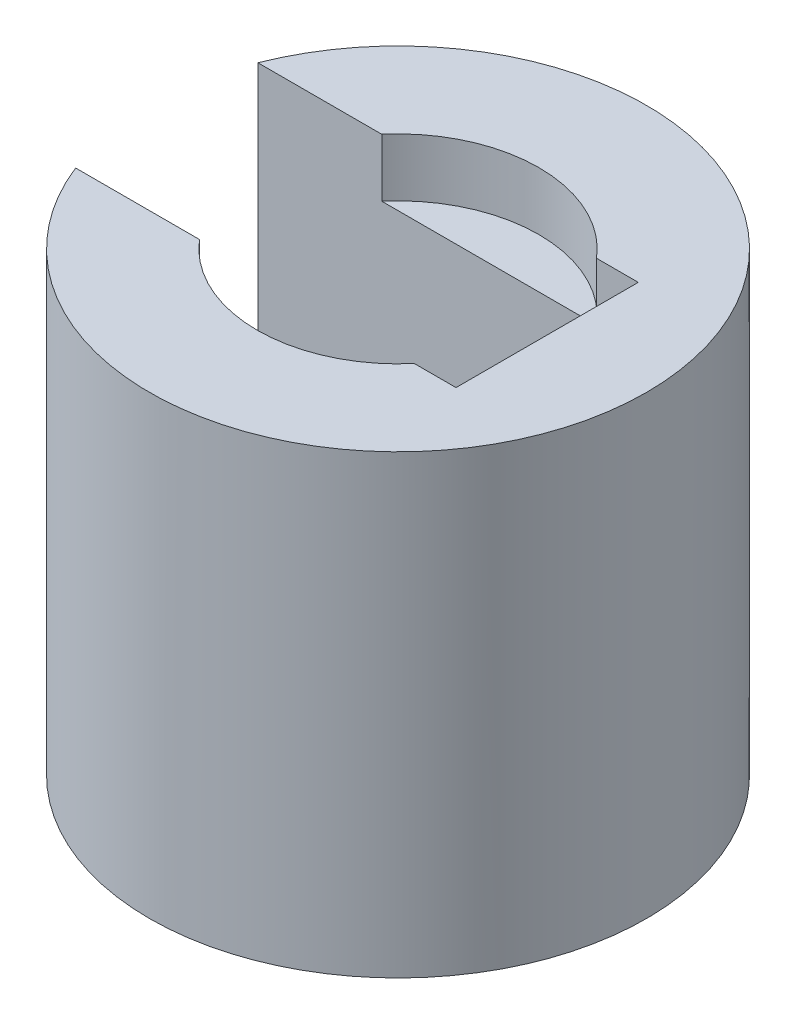
ISO-10303-21;
HEADER;
FILE_DESCRIPTION(('STEP AP214'),'2;1');
FILE_NAME('part.step','',(''),(''),'','','');
FILE_SCHEMA(('AUTOMOTIVE_DESIGN { 1 0 10303 214 1 1 1 1 }'));
ENDSEC;
DATA;
#1=APPLICATION_CONTEXT('core data for automotive mechanical design processes');
#2=APPLICATION_PROTOCOL_DEFINITION('international standard','automotive_design',2000,#1);
#3=PRODUCT_CONTEXT('',#1,'mechanical');
#4=PRODUCT('Part','Part','',(#3));
#5=PRODUCT_RELATED_PRODUCT_CATEGORY('part','',(#4));
#6=PRODUCT_DEFINITION_FORMATION('','',#4);
#7=PRODUCT_DEFINITION_CONTEXT('part definition',#1,'design');
#8=PRODUCT_DEFINITION('design','',#6,#7);
#9=PRODUCT_DEFINITION_SHAPE('','',#8);
#10=(LENGTH_UNIT() NAMED_UNIT(*) SI_UNIT(.MILLI.,.METRE.));
#11=(NAMED_UNIT(*) PLANE_ANGLE_UNIT() SI_UNIT($,.RADIAN.));
#12=(NAMED_UNIT(*) SI_UNIT($,.STERADIAN.) SOLID_ANGLE_UNIT());
#13=UNCERTAINTY_MEASURE_WITH_UNIT(LENGTH_MEASURE(1.E-05),#10,'distance_accuracy_value','');
#14=(GEOMETRIC_REPRESENTATION_CONTEXT(3) GLOBAL_UNCERTAINTY_ASSIGNED_CONTEXT((#13)) GLOBAL_UNIT_ASSIGNED_CONTEXT((#10,
#11,#12)) REPRESENTATION_CONTEXT('',''));
#15=CARTESIAN_POINT('',(0.,0.,0.));
#16=DIRECTION('',(0.,0.,1.));
#17=DIRECTION('',(1.,0.,0.));
#18=AXIS2_PLACEMENT_3D('',#15,#16,#17);
#19=CARTESIAN_POINT('',(0.,55.,0.));
#20=DIRECTION('',(0.,-1.,0.));
#21=DIRECTION('',(0.,0.,-1.));
#22=AXIS2_PLACEMENT_3D('',#19,#20,#21);
#23=CYLINDRICAL_SURFACE('',#22,30.);
#24=CARTESIAN_POINT('',(0.,0.,0.));
#25=DIRECTION('',(0.,1.,0.));
#26=DIRECTION('',(0.,0.,1.));
#27=AXIS2_PLACEMENT_3D('',#24,#25,#26);
#28=CIRCLE('',#27,30.);
#29=CARTESIAN_POINT('',(0.,0.,30.));
#30=VERTEX_POINT('',#29);
#31=EDGE_CURVE('E197',#30,#30,#28,.T.);
#32=ORIENTED_EDGE('',*,*,#31,.T.);
#33=EDGE_LOOP('',(#32));
#34=FACE_BOUND('',#33,.T.);
#35=DIRECTION('',(0.,-1.,0.));
#36=VECTOR('',#35,1.);
#37=CARTESIAN_POINT('',(-27.9105714739057,55.,-11.));
#38=LINE('',#37,#36);
#39=CARTESIAN_POINT('',(-27.9105714739057,55.,-11.));
#40=VERTEX_POINT('',#39);
#41=CARTESIAN_POINT('',(-27.9105714739057,5.,-11.));
#42=VERTEX_POINT('',#41);
#43=EDGE_CURVE('E120',#40,#42,#38,.T.);
#44=ORIENTED_EDGE('',*,*,#43,.F.);
#45=CARTESIAN_POINT('',(0.,55.,0.));
#46=DIRECTION('',(0.,1.,0.));
#47=DIRECTION('',(0.,0.,1.));
#48=AXIS2_PLACEMENT_3D('',#45,#46,#47);
#49=CIRCLE('',#48,30.);
#50=CARTESIAN_POINT('',(-27.9105714739057,55.,11.));
#51=VERTEX_POINT('',#50);
#52=EDGE_CURVE('E193',#51,#40,#49,.T.);
#53=ORIENTED_EDGE('',*,*,#52,.F.);
#54=DIRECTION('',(0.,-1.,0.));
#55=VECTOR('',#54,1.);
#56=CARTESIAN_POINT('',(-27.9105714739057,55.,11.));
#57=LINE('',#56,#55);
#58=CARTESIAN_POINT('',(-27.9105714739057,5.,11.));
#59=VERTEX_POINT('',#58);
#60=EDGE_CURVE('E177',#51,#59,#57,.T.);
#61=ORIENTED_EDGE('',*,*,#60,.T.);
#62=CARTESIAN_POINT('',(0.,5.,0.));
#63=DIRECTION('',(0.,1.,0.));
#64=DIRECTION('',(0.,0.,1.));
#65=AXIS2_PLACEMENT_3D('',#62,#63,#64);
#66=CIRCLE('',#65,30.);
#67=EDGE_CURVE('E11',#42,#59,#66,.T.);
#68=ORIENTED_EDGE('',*,*,#67,.F.);
#69=EDGE_LOOP('',(#44,#53,#61,#68));
#70=FACE_BOUND('',#69,.T.);
#71=ADVANCED_FACE('F39',(#34,#70),#23,.T.);
#72=CARTESIAN_POINT('',(0.,55.,0.));
#73=DIRECTION('',(0.,1.,0.));
#74=DIRECTION('',(0.,0.,1.));
#75=AXIS2_PLACEMENT_3D('',#72,#73,#74);
#76=PLANE('',#75);
#77=ORIENTED_EDGE('',*,*,#52,.T.);
#78=DIRECTION('',(1.,0.,0.));
#79=VECTOR('',#78,1.);
#80=CARTESIAN_POINT('',(-35.9841909879814,55.,-11.));
#81=LINE('',#80,#79);
#82=CARTESIAN_POINT('',(-12.9614813968157,55.,-11.));
#83=VERTEX_POINT('',#82);
#84=EDGE_CURVE('E157',#40,#83,#81,.T.);
#85=ORIENTED_EDGE('',*,*,#84,.T.);
#86=CARTESIAN_POINT('',(0.,55.,0.));
#87=DIRECTION('',(0.,1.,0.));
#88=DIRECTION('',(0.,0.,1.));
#89=AXIS2_PLACEMENT_3D('',#86,#87,#88);
#90=CIRCLE('',#89,17.);
#91=CARTESIAN_POINT('',(12.9614813968157,55.,-11.));
#92=VERTEX_POINT('',#91);
#93=EDGE_CURVE('E190',#92,#83,#90,.T.);
#94=ORIENTED_EDGE('',*,*,#93,.F.);
#95=CARTESIAN_POINT('',(18.,55.,-11.));
#96=VERTEX_POINT('',#95);
#97=EDGE_CURVE('E165',#92,#96,#81,.T.);
#98=ORIENTED_EDGE('',*,*,#97,.T.);
#99=DIRECTION('',(0.,0.,1.));
#100=VECTOR('',#99,1.);
#101=CARTESIAN_POINT('',(18.,55.,-11.));
#102=LINE('',#101,#100);
#103=CARTESIAN_POINT('',(18.,55.,11.));
#104=VERTEX_POINT('',#103);
#105=EDGE_CURVE('E162',#96,#104,#102,.T.);
#106=ORIENTED_EDGE('',*,*,#105,.T.);
#107=DIRECTION('',(1.,0.,0.));
#108=VECTOR('',#107,1.);
#109=CARTESIAN_POINT('',(-35.9841909879814,55.,11.));
#110=LINE('',#109,#108);
#111=CARTESIAN_POINT('',(12.9614813968157,55.,11.));
#112=VERTEX_POINT('',#111);
#113=EDGE_CURVE('E156',#112,#104,#110,.T.);
#114=ORIENTED_EDGE('',*,*,#113,.F.);
#115=CARTESIAN_POINT('',(-12.9614813968157,55.,11.));
#116=VERTEX_POINT('',#115);
#117=EDGE_CURVE('E185',#116,#112,#90,.T.);
#118=ORIENTED_EDGE('',*,*,#117,.F.);
#119=EDGE_CURVE('E161',#51,#116,#110,.T.);
#120=ORIENTED_EDGE('',*,*,#119,.F.);
#121=EDGE_LOOP('',(#77,#85,#94,#98,#106,#114,#118,#120));
#122=FACE_BOUND('',#121,.T.);
#123=ADVANCED_FACE('F213',(#122),#76,.T.);
#124=CARTESIAN_POINT('',(0.,48.,0.));
#125=DIRECTION('',(0.,1.,0.));
#126=DIRECTION('',(0.,0.,1.));
#127=AXIS2_PLACEMENT_3D('',#124,#125,#126);
#128=CYLINDRICAL_SURFACE('',#127,17.);
#129=DIRECTION('',(0.,1.,0.));
#130=VECTOR('',#129,1.);
#131=CARTESIAN_POINT('',(12.9614813968157,48.,-11.));
#132=LINE('',#131,#130);
#133=CARTESIAN_POINT('',(12.9614813968157,48.,-11.));
#134=VERTEX_POINT('',#133);
#135=EDGE_CURVE('E182',#92,#134,#132,.F.);
#136=ORIENTED_EDGE('',*,*,#135,.F.);
#137=ORIENTED_EDGE('',*,*,#93,.T.);
#138=DIRECTION('',(0.,1.,0.));
#139=VECTOR('',#138,1.);
#140=CARTESIAN_POINT('',(-12.9614813968157,48.,-11.));
#141=LINE('',#140,#139);
#142=CARTESIAN_POINT('',(-12.9614813968157,48.,-11.));
#143=VERTEX_POINT('',#142);
#144=EDGE_CURVE('E180',#143,#83,#141,.T.);
#145=ORIENTED_EDGE('',*,*,#144,.F.);
#146=CARTESIAN_POINT('',(0.,48.,0.));
#147=DIRECTION('',(0.,1.,0.));
#148=DIRECTION('',(0.,0.,1.));
#149=AXIS2_PLACEMENT_3D('',#146,#147,#148);
#150=CIRCLE('',#149,17.);
#151=EDGE_CURVE('E189',#134,#143,#150,.T.);
#152=ORIENTED_EDGE('',*,*,#151,.F.);
#153=EDGE_LOOP('',(#136,#137,#145,#152));
#154=FACE_BOUND('',#153,.T.);
#155=ADVANCED_FACE('F208',(#154),#128,.F.);
#156=CARTESIAN_POINT('',(0.,48.,0.));
#157=DIRECTION('',(0.,1.,0.));
#158=DIRECTION('',(0.,0.,1.));
#159=AXIS2_PLACEMENT_3D('',#156,#157,#158);
#160=PLANE('',#159);
#161=ORIENTED_EDGE('',*,*,#151,.T.);
#162=DIRECTION('',(1.,0.,0.));
#163=VECTOR('',#162,1.);
#164=CARTESIAN_POINT('',(0.,48.,-11.));
#165=LINE('',#164,#163);
#166=EDGE_CURVE('E46',#143,#134,#165,.T.);
#167=ORIENTED_EDGE('',*,*,#166,.T.);
#168=EDGE_LOOP('',(#161,#167));
#169=FACE_BOUND('',#168,.T.);
#170=ADVANCED_FACE('F204',(#169),#160,.T.);
#171=CARTESIAN_POINT('',(0.,0.,0.));
#172=DIRECTION('',(0.,1.,0.));
#173=DIRECTION('',(0.,0.,1.));
#174=AXIS2_PLACEMENT_3D('',#171,#172,#173);
#175=PLANE('',#174);
#176=ORIENTED_EDGE('',*,*,#31,.F.);
#177=EDGE_LOOP('',(#176));
#178=FACE_BOUND('',#177,.T.);
#179=ADVANCED_FACE('F246',(#178),#175,.F.);
#180=ORIENTED_EDGE('',*,*,#117,.T.);
#181=DIRECTION('',(0.,1.,0.));
#182=VECTOR('',#181,1.);
#183=CARTESIAN_POINT('',(12.9614813968157,48.,11.));
#184=LINE('',#183,#182);
#185=CARTESIAN_POINT('',(12.9614813968157,48.,11.));
#186=VERTEX_POINT('',#185);
#187=EDGE_CURVE('E174',#112,#186,#184,.F.);
#188=ORIENTED_EDGE('',*,*,#187,.T.);
#189=CARTESIAN_POINT('',(-12.9614813968157,48.,11.));
#190=VERTEX_POINT('',#189);
#191=EDGE_CURVE('E186',#190,#186,#150,.T.);
#192=ORIENTED_EDGE('',*,*,#191,.F.);
#193=DIRECTION('',(0.,1.,0.));
#194=VECTOR('',#193,1.);
#195=CARTESIAN_POINT('',(-12.9614813968157,48.,11.));
#196=LINE('',#195,#194);
#197=EDGE_CURVE('E170',#190,#116,#196,.T.);
#198=ORIENTED_EDGE('',*,*,#197,.T.);
#199=EDGE_LOOP('',(#180,#188,#192,#198));
#200=FACE_BOUND('',#199,.T.);
#201=ADVANCED_FACE('F234',(#200),#128,.F.);
#202=DIRECTION('',(1.,0.,0.));
#203=VECTOR('',#202,1.);
#204=CARTESIAN_POINT('',(0.,48.,11.));
#205=LINE('',#204,#203);
#206=EDGE_CURVE('E196',#190,#186,#205,.T.);
#207=ORIENTED_EDGE('',*,*,#206,.F.);
#208=ORIENTED_EDGE('',*,*,#191,.T.);
#209=EDGE_LOOP('',(#207,#208));
#210=FACE_BOUND('',#209,.T.);
#211=ADVANCED_FACE('F238',(#210),#160,.T.);
#212=CARTESIAN_POINT('',(0.,5.,0.));
#213=DIRECTION('',(0.,1.,0.));
#214=DIRECTION('',(0.,0.,1.));
#215=AXIS2_PLACEMENT_3D('',#212,#213,#214);
#216=PLANE('',#215);
#217=ORIENTED_EDGE('',*,*,#67,.T.);
#218=DIRECTION('',(1.,0.,0.));
#219=VECTOR('',#218,1.);
#220=CARTESIAN_POINT('',(-35.9841909879814,5.,11.));
#221=LINE('',#220,#219);
#222=CARTESIAN_POINT('',(23.9903810567665,5.,11.));
#223=VERTEX_POINT('',#222);
#224=EDGE_CURVE('E125',#59,#223,#221,.T.);
#225=ORIENTED_EDGE('',*,*,#224,.T.);
#226=DIRECTION('',(0.,0.,1.));
#227=VECTOR('',#226,1.);
#228=CARTESIAN_POINT('',(23.9903810567665,5.,-11.));
#229=LINE('',#228,#227);
#230=CARTESIAN_POINT('',(23.9903810567665,5.,-11.));
#231=VERTEX_POINT('',#230);
#232=EDGE_CURVE('E132',#231,#223,#229,.T.);
#233=ORIENTED_EDGE('',*,*,#232,.F.);
#234=DIRECTION('',(1.,0.,0.));
#235=VECTOR('',#234,1.);
#236=CARTESIAN_POINT('',(-35.9841909879814,5.,-11.));
#237=LINE('',#236,#235);
#238=EDGE_CURVE('E117',#42,#231,#237,.T.);
#239=ORIENTED_EDGE('',*,*,#238,.F.);
#240=EDGE_LOOP('',(#217,#225,#233,#239));
#241=FACE_BOUND('',#240,.T.);
#242=ADVANCED_FACE('F137',(#241),#216,.T.);
#243=CARTESIAN_POINT('',(-35.9841909879814,5.,-11.));
#244=DIRECTION('',(0.,0.,1.));
#245=DIRECTION('',(1.,0.,0.));
#246=AXIS2_PLACEMENT_3D('',#243,#244,#245);
#247=PLANE('',#246);
#248=DIRECTION('',(-0.499999999999995,0.866025403784442,0.));
#249=VECTOR('',#248,1.);
#250=CARTESIAN_POINT('',(11.,27.5,-11.));
#251=LINE('',#250,#249);
#252=CARTESIAN_POINT('',(11.,27.5,-11.));
#253=VERTEX_POINT('',#252);
#254=EDGE_CURVE('E53',#231,#253,#251,.T.);
#255=ORIENTED_EDGE('',*,*,#254,.T.);
#256=DIRECTION('',(0.,1.,0.));
#257=VECTOR('',#256,1.);
#258=CARTESIAN_POINT('',(11.,32.5,-11.));
#259=LINE('',#258,#257);
#260=CARTESIAN_POINT('',(11.,32.5,-11.));
#261=VERTEX_POINT('',#260);
#262=EDGE_CURVE('E57',#253,#261,#259,.T.);
#263=ORIENTED_EDGE('',*,*,#262,.T.);
#264=DIRECTION('',(1.,0.,0.));
#265=VECTOR('',#264,1.);
#266=CARTESIAN_POINT('',(18.,32.5,-11.));
#267=LINE('',#266,#265);
#268=CARTESIAN_POINT('',(18.,32.5,-11.));
#269=VERTEX_POINT('',#268);
#270=EDGE_CURVE('E135',#261,#269,#267,.T.);
#271=ORIENTED_EDGE('',*,*,#270,.T.);
#272=DIRECTION('',(0.,1.,0.));
#273=VECTOR('',#272,1.);
#274=CARTESIAN_POINT('',(18.,5.,-11.));
#275=LINE('',#274,#273);
#276=EDGE_CURVE('E168',#269,#96,#275,.T.);
#277=ORIENTED_EDGE('',*,*,#276,.T.);
#278=ORIENTED_EDGE('',*,*,#97,.F.);
#279=ORIENTED_EDGE('',*,*,#135,.T.);
#280=ORIENTED_EDGE('',*,*,#166,.F.);
#281=ORIENTED_EDGE('',*,*,#144,.T.);
#282=ORIENTED_EDGE('',*,*,#84,.F.);
#283=ORIENTED_EDGE('',*,*,#43,.T.);
#284=ORIENTED_EDGE('',*,*,#238,.T.);
#285=EDGE_LOOP('',(#255,#263,#271,#277,#278,#279,#280,#281,#282,#283,#284));
#286=FACE_BOUND('',#285,.T.);
#287=ADVANCED_FACE('F118',(#286),#247,.T.);
#288=CARTESIAN_POINT('',(-35.9841909879814,5.,11.));
#289=DIRECTION('',(0.,0.,1.));
#290=DIRECTION('',(1.,0.,0.));
#291=AXIS2_PLACEMENT_3D('',#288,#289,#290);
#292=PLANE('',#291);
#293=DIRECTION('',(0.,-1.,0.));
#294=VECTOR('',#293,1.);
#295=CARTESIAN_POINT('',(11.,32.5,11.));
#296=LINE('',#295,#294);
#297=CARTESIAN_POINT('',(11.,32.5,11.));
#298=VERTEX_POINT('',#297);
#299=CARTESIAN_POINT('',(11.,27.5,11.));
#300=VERTEX_POINT('',#299);
#301=EDGE_CURVE('E145',#298,#300,#296,.T.);
#302=ORIENTED_EDGE('',*,*,#301,.T.);
#303=DIRECTION('',(0.499999999999995,-0.866025403784442,0.));
#304=VECTOR('',#303,1.);
#305=CARTESIAN_POINT('',(11.,27.5,11.));
#306=LINE('',#305,#304);
#307=EDGE_CURVE('E140',#300,#223,#306,.T.);
#308=ORIENTED_EDGE('',*,*,#307,.T.);
#309=ORIENTED_EDGE('',*,*,#224,.F.);
#310=ORIENTED_EDGE('',*,*,#60,.F.);
#311=ORIENTED_EDGE('',*,*,#119,.T.);
#312=ORIENTED_EDGE('',*,*,#197,.F.);
#313=ORIENTED_EDGE('',*,*,#206,.T.);
#314=ORIENTED_EDGE('',*,*,#187,.F.);
#315=ORIENTED_EDGE('',*,*,#113,.T.);
#316=DIRECTION('',(0.,1.,0.));
#317=VECTOR('',#316,1.);
#318=CARTESIAN_POINT('',(18.,5.,11.));
#319=LINE('',#318,#317);
#320=CARTESIAN_POINT('',(18.,32.5,11.));
#321=VERTEX_POINT('',#320);
#322=EDGE_CURVE('E124',#321,#104,#319,.T.);
#323=ORIENTED_EDGE('',*,*,#322,.F.);
#324=DIRECTION('',(-1.,0.,0.));
#325=VECTOR('',#324,1.);
#326=CARTESIAN_POINT('',(18.,32.5,11.));
#327=LINE('',#326,#325);
#328=EDGE_CURVE('E142',#321,#298,#327,.T.);
#329=ORIENTED_EDGE('',*,*,#328,.T.);
#330=EDGE_LOOP('',(#302,#308,#309,#310,#311,#312,#313,#314,#315,#323,#329));
#331=FACE_BOUND('',#330,.T.);
#332=ADVANCED_FACE('F219',(#331),#292,.F.);
#333=CARTESIAN_POINT('',(18.,5.,-11.));
#334=DIRECTION('',(-1.,0.,0.));
#335=DIRECTION('',(0.,0.,1.));
#336=AXIS2_PLACEMENT_3D('',#333,#334,#335);
#337=PLANE('',#336);
#338=DIRECTION('',(0.,0.,1.));
#339=VECTOR('',#338,1.);
#340=CARTESIAN_POINT('',(18.,32.5,-29.4998258513378));
#341=LINE('',#340,#339);
#342=EDGE_CURVE('E147',#269,#321,#341,.T.);
#343=ORIENTED_EDGE('',*,*,#342,.T.);
#344=ORIENTED_EDGE('',*,*,#322,.T.);
#345=ORIENTED_EDGE('',*,*,#105,.F.);
#346=ORIENTED_EDGE('',*,*,#276,.F.);
#347=EDGE_LOOP('',(#343,#344,#345,#346));
#348=FACE_BOUND('',#347,.T.);
#349=ADVANCED_FACE('F231',(#348),#337,.T.);
#350=CARTESIAN_POINT('',(11.,27.5,-29.4998258513378));
#351=DIRECTION('',(-0.866025403784441,-0.499999999999995,0.));
#352=DIRECTION('',(0.499999999999995,-0.866025403784442,0.));
#353=AXIS2_PLACEMENT_3D('',#350,#351,#352);
#354=PLANE('',#353);
#355=ORIENTED_EDGE('',*,*,#254,.F.);
#356=ORIENTED_EDGE('',*,*,#232,.T.);
#357=ORIENTED_EDGE('',*,*,#307,.F.);
#358=DIRECTION('',(0.,0.,1.));
#359=VECTOR('',#358,1.);
#360=CARTESIAN_POINT('',(11.,27.5,-29.4998258513378));
#361=LINE('',#360,#359);
#362=EDGE_CURVE('E134',#253,#300,#361,.T.);
#363=ORIENTED_EDGE('',*,*,#362,.F.);
#364=EDGE_LOOP('',(#355,#356,#357,#363));
#365=FACE_BOUND('',#364,.T.);
#366=ADVANCED_FACE('F130',(#365),#354,.T.);
#367=CARTESIAN_POINT('',(11.,32.5,-29.4998258513378));
#368=DIRECTION('',(-1.,0.,0.));
#369=DIRECTION('',(0.,0.,1.));
#370=AXIS2_PLACEMENT_3D('',#367,#368,#369);
#371=PLANE('',#370);
#372=ORIENTED_EDGE('',*,*,#262,.F.);
#373=ORIENTED_EDGE('',*,*,#362,.T.);
#374=ORIENTED_EDGE('',*,*,#301,.F.);
#375=DIRECTION('',(0.,0.,1.));
#376=VECTOR('',#375,1.);
#377=CARTESIAN_POINT('',(11.,32.5,-29.4998258513378));
#378=LINE('',#377,#376);
#379=EDGE_CURVE('E151',#261,#298,#378,.T.);
#380=ORIENTED_EDGE('',*,*,#379,.F.);
#381=EDGE_LOOP('',(#372,#373,#374,#380));
#382=FACE_BOUND('',#381,.T.);
#383=ADVANCED_FACE('F224',(#382),#371,.T.);
#384=CARTESIAN_POINT('',(18.,32.5,-29.4998258513378));
#385=DIRECTION('',(0.,1.,0.));
#386=DIRECTION('',(0.,0.,1.));
#387=AXIS2_PLACEMENT_3D('',#384,#385,#386);
#388=PLANE('',#387);
#389=ORIENTED_EDGE('',*,*,#270,.F.);
#390=ORIENTED_EDGE('',*,*,#379,.T.);
#391=ORIENTED_EDGE('',*,*,#328,.F.);
#392=ORIENTED_EDGE('',*,*,#342,.F.);
#393=EDGE_LOOP('',(#389,#390,#391,#392));
#394=FACE_BOUND('',#393,.T.);
#395=ADVANCED_FACE('F228',(#394),#388,.T.);
#396=CLOSED_SHELL('',(#71,#123,#155,#170,#179,#201,#211,#242,#287,#332,#349,#366,#383,#395));
#397=MANIFOLD_SOLID_BREP('B2',#396);
#398=ADVANCED_BREP_SHAPE_REPRESENTATION('',(#18,#397),#14);
#399=SHAPE_DEFINITION_REPRESENTATION(#9,#398);
ENDSEC;
END-ISO-10303-21;
